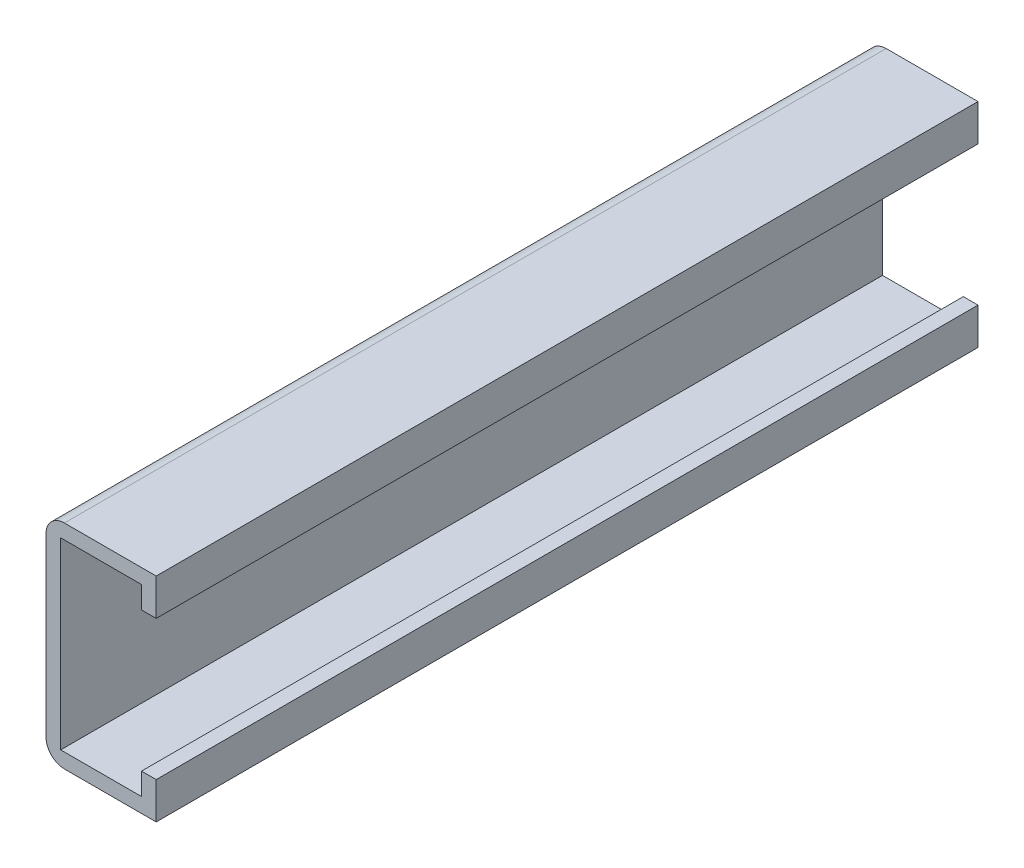
ISO-10303-21;
HEADER;
FILE_DESCRIPTION(('STEP AP214'),'2;1');
FILE_NAME('part.step','',(''),(''),'','','');
FILE_SCHEMA(('AUTOMOTIVE_DESIGN { 1 0 10303 214 1 1 1 1 }'));
ENDSEC;
DATA;
#1=APPLICATION_CONTEXT('core data for automotive mechanical design processes');
#2=APPLICATION_PROTOCOL_DEFINITION('international standard','automotive_design',2000,#1);
#3=PRODUCT_CONTEXT('',#1,'mechanical');
#4=PRODUCT('Part','Part','',(#3));
#5=PRODUCT_RELATED_PRODUCT_CATEGORY('part','',(#4));
#6=PRODUCT_DEFINITION_FORMATION('','',#4);
#7=PRODUCT_DEFINITION_CONTEXT('part definition',#1,'design');
#8=PRODUCT_DEFINITION('design','',#6,#7);
#9=PRODUCT_DEFINITION_SHAPE('','',#8);
#10=(LENGTH_UNIT() NAMED_UNIT(*) SI_UNIT(.MILLI.,.METRE.));
#11=(NAMED_UNIT(*) PLANE_ANGLE_UNIT() SI_UNIT($,.RADIAN.));
#12=(NAMED_UNIT(*) SI_UNIT($,.STERADIAN.) SOLID_ANGLE_UNIT());
#13=UNCERTAINTY_MEASURE_WITH_UNIT(LENGTH_MEASURE(1.E-05),#10,'distance_accuracy_value','');
#14=(GEOMETRIC_REPRESENTATION_CONTEXT(3) GLOBAL_UNCERTAINTY_ASSIGNED_CONTEXT((#13)) GLOBAL_UNIT_ASSIGNED_CONTEXT((#10,
#11,#12)) REPRESENTATION_CONTEXT('',''));
#15=CARTESIAN_POINT('',(0.,0.,0.));
#16=DIRECTION('',(0.,0.,1.));
#17=DIRECTION('',(1.,0.,0.));
#18=AXIS2_PLACEMENT_3D('',#15,#16,#17);
#19=CARTESIAN_POINT('',(-15.,29.,-223.76));
#20=DIRECTION('',(-1.,0.,0.));
#21=DIRECTION('',(0.,0.,1.));
#22=AXIS2_PLACEMENT_3D('',#19,#20,#21);
#23=PLANE('',#22);
#24=DIRECTION('',(0.,-1.,0.));
#25=VECTOR('',#24,1.);
#26=CARTESIAN_POINT('',(-15.,29.,-223.76));
#27=LINE('',#26,#25);
#28=CARTESIAN_POINT('',(-15.,24.,-223.76));
#29=VERTEX_POINT('',#28);
#30=CARTESIAN_POINT('',(-15.,-24.,-223.76));
#31=VERTEX_POINT('',#30);
#32=EDGE_CURVE('E159',#29,#31,#27,.T.);
#33=ORIENTED_EDGE('',*,*,#32,.T.);
#34=DIRECTION('',(0.,0.,1.));
#35=VECTOR('',#34,1.);
#36=CARTESIAN_POINT('',(-15.,-24.,-223.76));
#37=LINE('',#36,#35);
#38=CARTESIAN_POINT('',(-15.,-24.,0.));
#39=VERTEX_POINT('',#38);
#40=EDGE_CURVE('E285',#31,#39,#37,.T.);
#41=ORIENTED_EDGE('',*,*,#40,.T.);
#42=DIRECTION('',(0.,-1.,0.));
#43=VECTOR('',#42,1.);
#44=CARTESIAN_POINT('',(-15.,29.,0.));
#45=LINE('',#44,#43);
#46=CARTESIAN_POINT('',(-15.,24.,0.));
#47=VERTEX_POINT('',#46);
#48=EDGE_CURVE('E211',#47,#39,#45,.T.);
#49=ORIENTED_EDGE('',*,*,#48,.F.);
#50=DIRECTION('',(0.,0.,1.));
#51=VECTOR('',#50,1.);
#52=CARTESIAN_POINT('',(-15.,24.,-223.76));
#53=LINE('',#52,#51);
#54=EDGE_CURVE('E259',#47,#29,#53,.F.);
#55=ORIENTED_EDGE('',*,*,#54,.T.);
#56=EDGE_LOOP('',(#33,#41,#49,#55));
#57=FACE_BOUND('',#56,.T.);
#58=ADVANCED_FACE('F47',(#57),#23,.T.);
#59=CARTESIAN_POINT('',(-15.,29.,-223.76));
#60=DIRECTION('',(0.,1.,0.));
#61=DIRECTION('',(0.,0.,1.));
#62=AXIS2_PLACEMENT_3D('',#59,#60,#61);
#63=PLANE('',#62);
#64=DIRECTION('',(-1.,0.,0.));
#65=VECTOR('',#64,1.);
#66=CARTESIAN_POINT('',(-15.,29.,-223.76));
#67=LINE('',#66,#65);
#68=CARTESIAN_POINT('',(15.,29.,-223.76));
#69=VERTEX_POINT('',#68);
#70=CARTESIAN_POINT('',(-9.99999999999999,29.,-223.76));
#71=VERTEX_POINT('',#70);
#72=EDGE_CURVE('E168',#69,#71,#67,.T.);
#73=ORIENTED_EDGE('',*,*,#72,.T.);
#74=DIRECTION('',(0.,0.,1.));
#75=VECTOR('',#74,1.);
#76=CARTESIAN_POINT('',(-9.99999999999999,29.,-223.76));
#77=LINE('',#76,#75);
#78=CARTESIAN_POINT('',(-9.99999999999999,29.,0.));
#79=VERTEX_POINT('',#78);
#80=EDGE_CURVE('E11',#71,#79,#77,.T.);
#81=ORIENTED_EDGE('',*,*,#80,.T.);
#82=DIRECTION('',(-1.,0.,0.));
#83=VECTOR('',#82,1.);
#84=CARTESIAN_POINT('',(-15.,29.,0.));
#85=LINE('',#84,#83);
#86=CARTESIAN_POINT('',(15.,29.,0.));
#87=VERTEX_POINT('',#86);
#88=EDGE_CURVE('E252',#87,#79,#85,.T.);
#89=ORIENTED_EDGE('',*,*,#88,.F.);
#90=DIRECTION('',(0.,0.,1.));
#91=VECTOR('',#90,1.);
#92=CARTESIAN_POINT('',(15.,29.,-223.76));
#93=LINE('',#92,#91);
#94=EDGE_CURVE('E256',#69,#87,#93,.T.);
#95=ORIENTED_EDGE('',*,*,#94,.F.);
#96=EDGE_LOOP('',(#73,#81,#89,#95));
#97=FACE_BOUND('',#96,.T.);
#98=ADVANCED_FACE('F313',(#97),#63,.T.);
#99=CARTESIAN_POINT('',(15.,29.,-223.76));
#100=DIRECTION('',(1.,0.,0.));
#101=DIRECTION('',(0.,1.,0.));
#102=AXIS2_PLACEMENT_3D('',#99,#100,#101);
#103=PLANE('',#102);
#104=DIRECTION('',(0.,1.,0.));
#105=VECTOR('',#104,1.);
#106=CARTESIAN_POINT('',(15.,29.,0.));
#107=LINE('',#106,#105);
#108=CARTESIAN_POINT('',(15.,19.,0.));
#109=VERTEX_POINT('',#108);
#110=EDGE_CURVE('E248',#109,#87,#107,.T.);
#111=ORIENTED_EDGE('',*,*,#110,.F.);
#112=DIRECTION('',(0.,0.,1.));
#113=VECTOR('',#112,1.);
#114=CARTESIAN_POINT('',(15.,19.,-223.76));
#115=LINE('',#114,#113);
#116=CARTESIAN_POINT('',(15.,19.,-223.76));
#117=VERTEX_POINT('',#116);
#118=EDGE_CURVE('E260',#117,#109,#115,.T.);
#119=ORIENTED_EDGE('',*,*,#118,.F.);
#120=DIRECTION('',(0.,1.,0.));
#121=VECTOR('',#120,1.);
#122=CARTESIAN_POINT('',(15.,29.,-223.76));
#123=LINE('',#122,#121);
#124=EDGE_CURVE('E205',#117,#69,#123,.T.);
#125=ORIENTED_EDGE('',*,*,#124,.T.);
#126=ORIENTED_EDGE('',*,*,#94,.T.);
#127=EDGE_LOOP('',(#111,#119,#125,#126));
#128=FACE_BOUND('',#127,.T.);
#129=ADVANCED_FACE('F317',(#128),#103,.T.);
#130=CARTESIAN_POINT('',(11.,19.,-223.76));
#131=DIRECTION('',(0.,-1.,0.));
#132=DIRECTION('',(0.,0.,-1.));
#133=AXIS2_PLACEMENT_3D('',#130,#131,#132);
#134=PLANE('',#133);
#135=DIRECTION('',(1.,0.,0.));
#136=VECTOR('',#135,1.);
#137=CARTESIAN_POINT('',(11.,19.,0.));
#138=LINE('',#137,#136);
#139=CARTESIAN_POINT('',(11.,19.,0.));
#140=VERTEX_POINT('',#139);
#141=EDGE_CURVE('E244',#140,#109,#138,.T.);
#142=ORIENTED_EDGE('',*,*,#141,.F.);
#143=DIRECTION('',(0.,0.,1.));
#144=VECTOR('',#143,1.);
#145=CARTESIAN_POINT('',(11.,19.,-223.76));
#146=LINE('',#145,#144);
#147=CARTESIAN_POINT('',(11.,19.,-223.76));
#148=VERTEX_POINT('',#147);
#149=EDGE_CURVE('E263',#148,#140,#146,.T.);
#150=ORIENTED_EDGE('',*,*,#149,.F.);
#151=DIRECTION('',(1.,0.,0.));
#152=VECTOR('',#151,1.);
#153=CARTESIAN_POINT('',(11.,19.,-223.76));
#154=LINE('',#153,#152);
#155=EDGE_CURVE('E201',#148,#117,#154,.T.);
#156=ORIENTED_EDGE('',*,*,#155,.T.);
#157=ORIENTED_EDGE('',*,*,#118,.T.);
#158=EDGE_LOOP('',(#142,#150,#156,#157));
#159=FACE_BOUND('',#158,.T.);
#160=ADVANCED_FACE('F322',(#159),#134,.T.);
#161=CARTESIAN_POINT('',(11.,25.,-223.76));
#162=DIRECTION('',(-1.,0.,0.));
#163=DIRECTION('',(0.,-1.,0.));
#164=AXIS2_PLACEMENT_3D('',#161,#162,#163);
#165=PLANE('',#164);
#166=DIRECTION('',(0.,-1.,0.));
#167=VECTOR('',#166,1.);
#168=CARTESIAN_POINT('',(11.,25.,0.));
#169=LINE('',#168,#167);
#170=CARTESIAN_POINT('',(11.,25.,0.));
#171=VERTEX_POINT('',#170);
#172=EDGE_CURVE('E240',#171,#140,#169,.T.);
#173=ORIENTED_EDGE('',*,*,#172,.F.);
#174=DIRECTION('',(0.,0.,1.));
#175=VECTOR('',#174,1.);
#176=CARTESIAN_POINT('',(11.,25.,-223.76));
#177=LINE('',#176,#175);
#178=CARTESIAN_POINT('',(11.,25.,-223.76));
#179=VERTEX_POINT('',#178);
#180=EDGE_CURVE('E266',#179,#171,#177,.T.);
#181=ORIENTED_EDGE('',*,*,#180,.F.);
#182=DIRECTION('',(0.,-1.,0.));
#183=VECTOR('',#182,1.);
#184=CARTESIAN_POINT('',(11.,25.,-223.76));
#185=LINE('',#184,#183);
#186=EDGE_CURVE('E197',#179,#148,#185,.T.);
#187=ORIENTED_EDGE('',*,*,#186,.T.);
#188=ORIENTED_EDGE('',*,*,#149,.T.);
#189=EDGE_LOOP('',(#173,#181,#187,#188));
#190=FACE_BOUND('',#189,.T.);
#191=ADVANCED_FACE('F325',(#190),#165,.T.);
#192=CARTESIAN_POINT('',(-11.,25.,-223.76));
#193=DIRECTION('',(0.,-1.,0.));
#194=DIRECTION('',(0.,0.,-1.));
#195=AXIS2_PLACEMENT_3D('',#192,#193,#194);
#196=PLANE('',#195);
#197=DIRECTION('',(1.,0.,0.));
#198=VECTOR('',#197,1.);
#199=CARTESIAN_POINT('',(-11.,25.,0.));
#200=LINE('',#199,#198);
#201=CARTESIAN_POINT('',(-11.,25.,0.));
#202=VERTEX_POINT('',#201);
#203=EDGE_CURVE('E236',#202,#171,#200,.T.);
#204=ORIENTED_EDGE('',*,*,#203,.F.);
#205=DIRECTION('',(0.,0.,1.));
#206=VECTOR('',#205,1.);
#207=CARTESIAN_POINT('',(-11.,25.,-223.76));
#208=LINE('',#207,#206);
#209=CARTESIAN_POINT('',(-11.,25.,-223.76));
#210=VERTEX_POINT('',#209);
#211=EDGE_CURVE('E269',#210,#202,#208,.T.);
#212=ORIENTED_EDGE('',*,*,#211,.F.);
#213=DIRECTION('',(1.,0.,0.));
#214=VECTOR('',#213,1.);
#215=CARTESIAN_POINT('',(-11.,25.,-223.76));
#216=LINE('',#215,#214);
#217=EDGE_CURVE('E193',#210,#179,#216,.T.);
#218=ORIENTED_EDGE('',*,*,#217,.T.);
#219=ORIENTED_EDGE('',*,*,#180,.T.);
#220=EDGE_LOOP('',(#204,#212,#218,#219));
#221=FACE_BOUND('',#220,.T.);
#222=ADVANCED_FACE('F330',(#221),#196,.T.);
#223=CARTESIAN_POINT('',(-11.,25.,-223.76));
#224=DIRECTION('',(1.,0.,0.));
#225=DIRECTION('',(0.,0.,-1.));
#226=AXIS2_PLACEMENT_3D('',#223,#224,#225);
#227=PLANE('',#226);
#228=DIRECTION('',(0.,1.,0.));
#229=VECTOR('',#228,1.);
#230=CARTESIAN_POINT('',(-11.,25.,0.));
#231=LINE('',#230,#229);
#232=CARTESIAN_POINT('',(-11.,-25.,0.));
#233=VERTEX_POINT('',#232);
#234=EDGE_CURVE('E232',#233,#202,#231,.T.);
#235=ORIENTED_EDGE('',*,*,#234,.F.);
#236=DIRECTION('',(0.,0.,1.));
#237=VECTOR('',#236,1.);
#238=CARTESIAN_POINT('',(-11.,-25.,-223.76));
#239=LINE('',#238,#237);
#240=CARTESIAN_POINT('',(-11.,-25.,-223.76));
#241=VERTEX_POINT('',#240);
#242=EDGE_CURVE('E272',#241,#233,#239,.T.);
#243=ORIENTED_EDGE('',*,*,#242,.F.);
#244=DIRECTION('',(0.,1.,0.));
#245=VECTOR('',#244,1.);
#246=CARTESIAN_POINT('',(-11.,25.,-223.76));
#247=LINE('',#246,#245);
#248=EDGE_CURVE('E189',#241,#210,#247,.T.);
#249=ORIENTED_EDGE('',*,*,#248,.T.);
#250=ORIENTED_EDGE('',*,*,#211,.T.);
#251=EDGE_LOOP('',(#235,#243,#249,#250));
#252=FACE_BOUND('',#251,.T.);
#253=ADVANCED_FACE('F333',(#252),#227,.T.);
#254=CARTESIAN_POINT('',(-11.,-25.,-223.76));
#255=DIRECTION('',(0.,1.,0.));
#256=DIRECTION('',(0.,0.,1.));
#257=AXIS2_PLACEMENT_3D('',#254,#255,#256);
#258=PLANE('',#257);
#259=DIRECTION('',(-1.,0.,0.));
#260=VECTOR('',#259,1.);
#261=CARTESIAN_POINT('',(-11.,-25.,0.));
#262=LINE('',#261,#260);
#263=CARTESIAN_POINT('',(11.,-25.,0.));
#264=VERTEX_POINT('',#263);
#265=EDGE_CURVE('E228',#264,#233,#262,.T.);
#266=ORIENTED_EDGE('',*,*,#265,.F.);
#267=DIRECTION('',(0.,0.,1.));
#268=VECTOR('',#267,1.);
#269=CARTESIAN_POINT('',(11.,-25.,-223.76));
#270=LINE('',#269,#268);
#271=CARTESIAN_POINT('',(11.,-25.,-223.76));
#272=VERTEX_POINT('',#271);
#273=EDGE_CURVE('E275',#272,#264,#270,.T.);
#274=ORIENTED_EDGE('',*,*,#273,.F.);
#275=DIRECTION('',(-1.,0.,0.));
#276=VECTOR('',#275,1.);
#277=CARTESIAN_POINT('',(-11.,-25.,-223.76));
#278=LINE('',#277,#276);
#279=EDGE_CURVE('E185',#272,#241,#278,.T.);
#280=ORIENTED_EDGE('',*,*,#279,.T.);
#281=ORIENTED_EDGE('',*,*,#242,.T.);
#282=EDGE_LOOP('',(#266,#274,#280,#281));
#283=FACE_BOUND('',#282,.T.);
#284=ADVANCED_FACE('F337',(#283),#258,.T.);
#285=CARTESIAN_POINT('',(11.,-19.,-223.76));
#286=DIRECTION('',(-1.,0.,0.));
#287=DIRECTION('',(0.,-1.,0.));
#288=AXIS2_PLACEMENT_3D('',#285,#286,#287);
#289=PLANE('',#288);
#290=DIRECTION('',(0.,-1.,0.));
#291=VECTOR('',#290,1.);
#292=CARTESIAN_POINT('',(11.,-19.,0.));
#293=LINE('',#292,#291);
#294=CARTESIAN_POINT('',(11.,-19.,0.));
#295=VERTEX_POINT('',#294);
#296=EDGE_CURVE('E224',#295,#264,#293,.T.);
#297=ORIENTED_EDGE('',*,*,#296,.F.);
#298=DIRECTION('',(0.,0.,1.));
#299=VECTOR('',#298,1.);
#300=CARTESIAN_POINT('',(11.,-19.,-223.76));
#301=LINE('',#300,#299);
#302=CARTESIAN_POINT('',(11.,-19.,-223.76));
#303=VERTEX_POINT('',#302);
#304=EDGE_CURVE('E278',#303,#295,#301,.T.);
#305=ORIENTED_EDGE('',*,*,#304,.F.);
#306=DIRECTION('',(0.,-1.,0.));
#307=VECTOR('',#306,1.);
#308=CARTESIAN_POINT('',(11.,-19.,-223.76));
#309=LINE('',#308,#307);
#310=EDGE_CURVE('E178',#303,#272,#309,.T.);
#311=ORIENTED_EDGE('',*,*,#310,.T.);
#312=ORIENTED_EDGE('',*,*,#273,.T.);
#313=EDGE_LOOP('',(#297,#305,#311,#312));
#314=FACE_BOUND('',#313,.T.);
#315=ADVANCED_FACE('F340',(#314),#289,.T.);
#316=CARTESIAN_POINT('',(11.,-19.,-223.76));
#317=DIRECTION('',(0.,1.,0.));
#318=DIRECTION('',(0.,0.,1.));
#319=AXIS2_PLACEMENT_3D('',#316,#317,#318);
#320=PLANE('',#319);
#321=DIRECTION('',(-1.,0.,0.));
#322=VECTOR('',#321,1.);
#323=CARTESIAN_POINT('',(11.,-19.,0.));
#324=LINE('',#323,#322);
#325=CARTESIAN_POINT('',(15.,-19.,0.));
#326=VERTEX_POINT('',#325);
#327=EDGE_CURVE('E220',#326,#295,#324,.T.);
#328=ORIENTED_EDGE('',*,*,#327,.F.);
#329=DIRECTION('',(0.,0.,1.));
#330=VECTOR('',#329,1.);
#331=CARTESIAN_POINT('',(15.,-19.,-223.76));
#332=LINE('',#331,#330);
#333=CARTESIAN_POINT('',(15.,-19.,-223.76));
#334=VERTEX_POINT('',#333);
#335=EDGE_CURVE('E167',#334,#326,#332,.T.);
#336=ORIENTED_EDGE('',*,*,#335,.F.);
#337=DIRECTION('',(-1.,0.,0.));
#338=VECTOR('',#337,1.);
#339=CARTESIAN_POINT('',(11.,-19.,-223.76));
#340=LINE('',#339,#338);
#341=EDGE_CURVE('E174',#334,#303,#340,.T.);
#342=ORIENTED_EDGE('',*,*,#341,.T.);
#343=ORIENTED_EDGE('',*,*,#304,.T.);
#344=EDGE_LOOP('',(#328,#336,#342,#343));
#345=FACE_BOUND('',#344,.T.);
#346=ADVANCED_FACE('F343',(#345),#320,.T.);
#347=CARTESIAN_POINT('',(15.,-19.,-223.76));
#348=DIRECTION('',(1.,0.,0.));
#349=DIRECTION('',(0.,1.,0.));
#350=AXIS2_PLACEMENT_3D('',#347,#348,#349);
#351=PLANE('',#350);
#352=DIRECTION('',(0.,1.,0.));
#353=VECTOR('',#352,1.);
#354=CARTESIAN_POINT('',(15.,-19.,0.));
#355=LINE('',#354,#353);
#356=CARTESIAN_POINT('',(15.,-29.,0.));
#357=VERTEX_POINT('',#356);
#358=EDGE_CURVE('E165',#357,#326,#355,.T.);
#359=ORIENTED_EDGE('',*,*,#358,.F.);
#360=DIRECTION('',(0.,0.,1.));
#361=VECTOR('',#360,1.);
#362=CARTESIAN_POINT('',(15.,-29.,-223.76));
#363=LINE('',#362,#361);
#364=CARTESIAN_POINT('',(15.,-29.,-223.76));
#365=VERTEX_POINT('',#364);
#366=EDGE_CURVE('E153',#365,#357,#363,.T.);
#367=ORIENTED_EDGE('',*,*,#366,.F.);
#368=DIRECTION('',(0.,1.,0.));
#369=VECTOR('',#368,1.);
#370=CARTESIAN_POINT('',(15.,-19.,-223.76));
#371=LINE('',#370,#369);
#372=EDGE_CURVE('E158',#365,#334,#371,.T.);
#373=ORIENTED_EDGE('',*,*,#372,.T.);
#374=ORIENTED_EDGE('',*,*,#335,.T.);
#375=EDGE_LOOP('',(#359,#367,#373,#374));
#376=FACE_BOUND('',#375,.T.);
#377=ADVANCED_FACE('F163',(#376),#351,.T.);
#378=CARTESIAN_POINT('',(-15.,-29.,-223.76));
#379=DIRECTION('',(0.,-1.,0.));
#380=DIRECTION('',(0.,0.,-1.));
#381=AXIS2_PLACEMENT_3D('',#378,#379,#380);
#382=PLANE('',#381);
#383=DIRECTION('',(1.,0.,0.));
#384=VECTOR('',#383,1.);
#385=CARTESIAN_POINT('',(-15.,-29.,0.));
#386=LINE('',#385,#384);
#387=CARTESIAN_POINT('',(-9.99999999999999,-29.,0.));
#388=VERTEX_POINT('',#387);
#389=EDGE_CURVE('E215',#388,#357,#386,.T.);
#390=ORIENTED_EDGE('',*,*,#389,.F.);
#391=DIRECTION('',(0.,0.,1.));
#392=VECTOR('',#391,1.);
#393=CARTESIAN_POINT('',(-9.99999999999999,-29.,-223.76));
#394=LINE('',#393,#392);
#395=CARTESIAN_POINT('',(-9.99999999999999,-29.,-223.76));
#396=VERTEX_POINT('',#395);
#397=EDGE_CURVE('E71',#388,#396,#394,.F.);
#398=ORIENTED_EDGE('',*,*,#397,.T.);
#399=DIRECTION('',(1.,0.,0.));
#400=VECTOR('',#399,1.);
#401=CARTESIAN_POINT('',(-15.,-29.,-223.76));
#402=LINE('',#401,#400);
#403=EDGE_CURVE('E150',#396,#365,#402,.T.);
#404=ORIENTED_EDGE('',*,*,#403,.T.);
#405=ORIENTED_EDGE('',*,*,#366,.T.);
#406=EDGE_LOOP('',(#390,#398,#404,#405));
#407=FACE_BOUND('',#406,.T.);
#408=ADVANCED_FACE('F152',(#407),#382,.T.);
#409=CARTESIAN_POINT('',(0.,0.,-223.76));
#410=DIRECTION('',(0.,0.,1.));
#411=DIRECTION('',(1.,0.,0.));
#412=AXIS2_PLACEMENT_3D('',#409,#410,#411);
#413=PLANE('',#412);
#414=ORIENTED_EDGE('',*,*,#403,.F.);
#415=CARTESIAN_POINT('',(-9.99999999999999,-24.,-223.76));
#416=DIRECTION('',(0.,0.,1.));
#417=DIRECTION('',(1.,0.,0.));
#418=AXIS2_PLACEMENT_3D('',#415,#416,#417);
#419=CIRCLE('',#418,5.);
#420=EDGE_CURVE('E56',#396,#31,#419,.F.);
#421=ORIENTED_EDGE('',*,*,#420,.T.);
#422=ORIENTED_EDGE('',*,*,#32,.F.);
#423=CARTESIAN_POINT('',(-9.99999999999999,24.,-223.76));
#424=DIRECTION('',(0.,0.,1.));
#425=DIRECTION('',(1.,0.,0.));
#426=AXIS2_PLACEMENT_3D('',#423,#424,#425);
#427=CIRCLE('',#426,5.);
#428=EDGE_CURVE('E63',#29,#71,#427,.F.);
#429=ORIENTED_EDGE('',*,*,#428,.T.);
#430=ORIENTED_EDGE('',*,*,#72,.F.);
#431=ORIENTED_EDGE('',*,*,#124,.F.);
#432=ORIENTED_EDGE('',*,*,#155,.F.);
#433=ORIENTED_EDGE('',*,*,#186,.F.);
#434=ORIENTED_EDGE('',*,*,#217,.F.);
#435=ORIENTED_EDGE('',*,*,#248,.F.);
#436=ORIENTED_EDGE('',*,*,#279,.F.);
#437=ORIENTED_EDGE('',*,*,#310,.F.);
#438=ORIENTED_EDGE('',*,*,#341,.F.);
#439=ORIENTED_EDGE('',*,*,#372,.F.);
#440=EDGE_LOOP('',(#414,#421,#422,#429,#430,#431,#432,#433,#434,#435,#436,#437,#438,#439));
#441=FACE_BOUND('',#440,.T.);
#442=ADVANCED_FACE('F171',(#441),#413,.F.);
#443=CARTESIAN_POINT('',(0.,0.,0.));
#444=DIRECTION('',(0.,0.,1.));
#445=DIRECTION('',(1.,0.,0.));
#446=AXIS2_PLACEMENT_3D('',#443,#444,#445);
#447=PLANE('',#446);
#448=ORIENTED_EDGE('',*,*,#48,.T.);
#449=CARTESIAN_POINT('',(-9.99999999999999,-24.,0.));
#450=DIRECTION('',(0.,0.,1.));
#451=DIRECTION('',(1.,0.,0.));
#452=AXIS2_PLACEMENT_3D('',#449,#450,#451);
#453=CIRCLE('',#452,5.);
#454=EDGE_CURVE('E292',#39,#388,#453,.T.);
#455=ORIENTED_EDGE('',*,*,#454,.T.);
#456=ORIENTED_EDGE('',*,*,#389,.T.);
#457=ORIENTED_EDGE('',*,*,#358,.T.);
#458=ORIENTED_EDGE('',*,*,#327,.T.);
#459=ORIENTED_EDGE('',*,*,#296,.T.);
#460=ORIENTED_EDGE('',*,*,#265,.T.);
#461=ORIENTED_EDGE('',*,*,#234,.T.);
#462=ORIENTED_EDGE('',*,*,#203,.T.);
#463=ORIENTED_EDGE('',*,*,#172,.T.);
#464=ORIENTED_EDGE('',*,*,#141,.T.);
#465=ORIENTED_EDGE('',*,*,#110,.T.);
#466=ORIENTED_EDGE('',*,*,#88,.T.);
#467=CARTESIAN_POINT('',(-9.99999999999999,24.,0.));
#468=DIRECTION('',(0.,0.,1.));
#469=DIRECTION('',(1.,0.,0.));
#470=AXIS2_PLACEMENT_3D('',#467,#468,#469);
#471=CIRCLE('',#470,5.);
#472=EDGE_CURVE('E289',#79,#47,#471,.T.);
#473=ORIENTED_EDGE('',*,*,#472,.T.);
#474=EDGE_LOOP('',(#448,#455,#456,#457,#458,#459,#460,#461,#462,#463,#464,#465,#466,#473));
#475=FACE_BOUND('',#474,.T.);
#476=ADVANCED_FACE('F308',(#475),#447,.T.);
#477=CARTESIAN_POINT('',(-9.99999999999999,-24.,-223.76));
#478=DIRECTION('',(0.,0.,1.));
#479=DIRECTION('',(1.,0.,0.));
#480=AXIS2_PLACEMENT_3D('',#477,#478,#479);
#481=CYLINDRICAL_SURFACE('',#480,5.);
#482=ORIENTED_EDGE('',*,*,#420,.F.);
#483=ORIENTED_EDGE('',*,*,#397,.F.);
#484=ORIENTED_EDGE('',*,*,#454,.F.);
#485=ORIENTED_EDGE('',*,*,#40,.F.);
#486=EDGE_LOOP('',(#482,#483,#484,#485));
#487=FACE_BOUND('',#486,.T.);
#488=ADVANCED_FACE('F306',(#487),#481,.T.);
#489=CARTESIAN_POINT('',(-9.99999999999999,24.,-223.76));
#490=DIRECTION('',(0.,0.,1.));
#491=DIRECTION('',(1.,0.,0.));
#492=AXIS2_PLACEMENT_3D('',#489,#490,#491);
#493=CYLINDRICAL_SURFACE('',#492,5.);
#494=ORIENTED_EDGE('',*,*,#428,.F.);
#495=ORIENTED_EDGE('',*,*,#54,.F.);
#496=ORIENTED_EDGE('',*,*,#472,.F.);
#497=ORIENTED_EDGE('',*,*,#80,.F.);
#498=EDGE_LOOP('',(#494,#495,#496,#497));
#499=FACE_BOUND('',#498,.T.);
#500=ADVANCED_FACE('F49',(#499),#493,.T.);
#501=CLOSED_SHELL('',(#58,#98,#129,#160,#191,#222,#253,#284,#315,#346,#377,#408,#442,#476,#488,#500));
#502=MANIFOLD_SOLID_BREP('B2',#501);
#503=ADVANCED_BREP_SHAPE_REPRESENTATION('',(#18,#502),#14);
#504=SHAPE_DEFINITION_REPRESENTATION(#9,#503);
ENDSEC;
END-ISO-10303-21;
